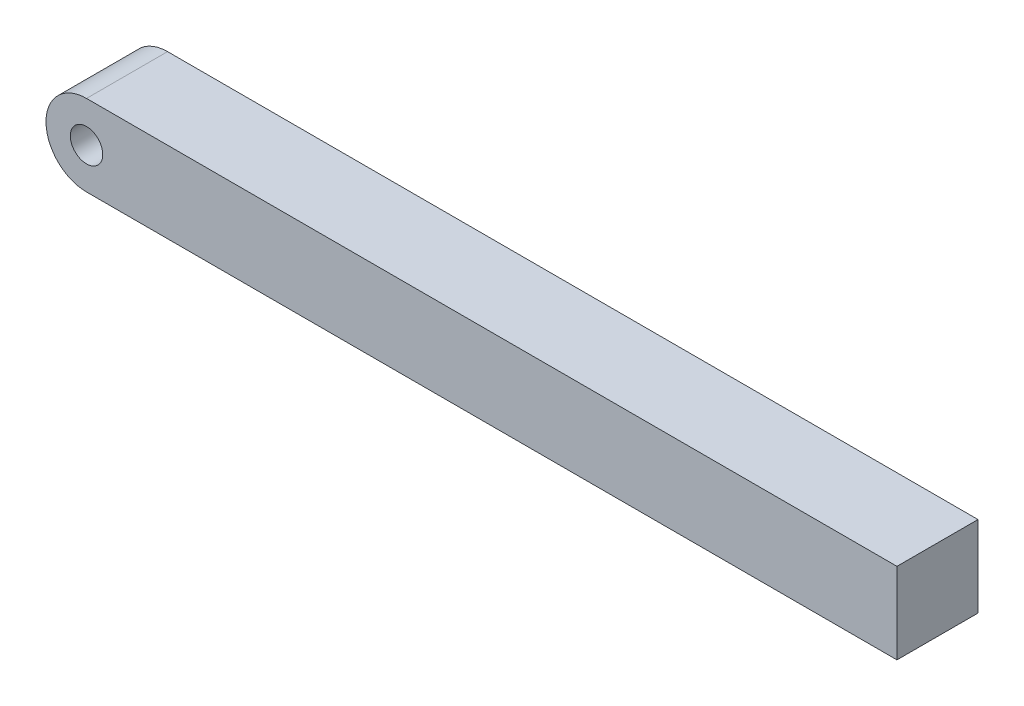
ISO-10303-21;
HEADER;
FILE_DESCRIPTION(('STEP AP214'),'2;1');
FILE_NAME('part.step','',(''),(''),'','','');
FILE_SCHEMA(('AUTOMOTIVE_DESIGN { 1 0 10303 214 1 1 1 1 }'));
ENDSEC;
DATA;
#1=APPLICATION_CONTEXT('core data for automotive mechanical design processes');
#2=APPLICATION_PROTOCOL_DEFINITION('international standard','automotive_design',2000,#1);
#3=PRODUCT_CONTEXT('',#1,'mechanical');
#4=PRODUCT('Part','Part','',(#3));
#5=PRODUCT_RELATED_PRODUCT_CATEGORY('part','',(#4));
#6=PRODUCT_DEFINITION_FORMATION('','',#4);
#7=PRODUCT_DEFINITION_CONTEXT('part definition',#1,'design');
#8=PRODUCT_DEFINITION('design','',#6,#7);
#9=PRODUCT_DEFINITION_SHAPE('','',#8);
#10=(LENGTH_UNIT() NAMED_UNIT(*) SI_UNIT(.MILLI.,.METRE.));
#11=(NAMED_UNIT(*) PLANE_ANGLE_UNIT() SI_UNIT($,.RADIAN.));
#12=(NAMED_UNIT(*) SI_UNIT($,.STERADIAN.) SOLID_ANGLE_UNIT());
#13=UNCERTAINTY_MEASURE_WITH_UNIT(LENGTH_MEASURE(1.E-05),#10,'distance_accuracy_value','');
#14=(GEOMETRIC_REPRESENTATION_CONTEXT(3) GLOBAL_UNCERTAINTY_ASSIGNED_CONTEXT((#13)) GLOBAL_UNIT_ASSIGNED_CONTEXT((#10,
#11,#12)) REPRESENTATION_CONTEXT('',''));
#15=CARTESIAN_POINT('',(0.,0.,0.));
#16=DIRECTION('',(0.,0.,1.));
#17=DIRECTION('',(1.,0.,0.));
#18=AXIS2_PLACEMENT_3D('',#15,#16,#17);
#19=CARTESIAN_POINT('',(-500.,3.7470027081099E-13,100.));
#20=DIRECTION('',(0.,0.,-1.));
#21=DIRECTION('',(-1.,0.,0.));
#22=AXIS2_PLACEMENT_3D('',#19,#20,#21);
#23=CYLINDRICAL_SURFACE('',#22,50.0000000000004);
#24=CARTESIAN_POINT('',(-500.,3.7470027081099E-13,0.));
#25=DIRECTION('',(0.,0.,1.));
#26=DIRECTION('',(1.,0.,0.));
#27=AXIS2_PLACEMENT_3D('',#24,#25,#26);
#28=CIRCLE('',#27,50.0000000000004);
#29=CARTESIAN_POINT('',(-500.,50.0000000000008,0.));
#30=VERTEX_POINT('',#29);
#31=CARTESIAN_POINT('',(-500.,-50.,0.));
#32=VERTEX_POINT('',#31);
#33=EDGE_CURVE('E106',#30,#32,#28,.T.);
#34=ORIENTED_EDGE('',*,*,#33,.T.);
#35=DIRECTION('',(0.,0.,-1.));
#36=VECTOR('',#35,1.);
#37=CARTESIAN_POINT('',(-500.,-50.,100.));
#38=LINE('',#37,#36);
#39=CARTESIAN_POINT('',(-500.,-50.,100.));
#40=VERTEX_POINT('',#39);
#41=EDGE_CURVE('E11',#40,#32,#38,.T.);
#42=ORIENTED_EDGE('',*,*,#41,.F.);
#43=CARTESIAN_POINT('',(-500.,3.7470027081099E-13,100.));
#44=DIRECTION('',(0.,0.,1.));
#45=DIRECTION('',(1.,0.,0.));
#46=AXIS2_PLACEMENT_3D('',#43,#44,#45);
#47=CIRCLE('',#46,50.0000000000004);
#48=CARTESIAN_POINT('',(-500.,50.0000000000008,100.));
#49=VERTEX_POINT('',#48);
#50=EDGE_CURVE('E89',#49,#40,#47,.T.);
#51=ORIENTED_EDGE('',*,*,#50,.F.);
#52=DIRECTION('',(0.,0.,-1.));
#53=VECTOR('',#52,1.);
#54=CARTESIAN_POINT('',(-500.,50.0000000000008,100.));
#55=LINE('',#54,#53);
#56=EDGE_CURVE('E55',#49,#30,#55,.T.);
#57=ORIENTED_EDGE('',*,*,#56,.T.);
#58=EDGE_LOOP('',(#34,#42,#51,#57));
#59=FACE_BOUND('',#58,.T.);
#60=ADVANCED_FACE('F39',(#59),#23,.T.);
#61=CARTESIAN_POINT('',(0.,-50.,100.));
#62=DIRECTION('',(0.,1.,0.));
#63=DIRECTION('',(0.,0.,1.));
#64=AXIS2_PLACEMENT_3D('',#61,#62,#63);
#65=PLANE('',#64);
#66=DIRECTION('',(1.,0.,0.));
#67=VECTOR('',#66,1.);
#68=CARTESIAN_POINT('',(0.,-50.,0.));
#69=LINE('',#68,#67);
#70=CARTESIAN_POINT('',(500.000000000007,-50.,0.));
#71=VERTEX_POINT('',#70);
#72=EDGE_CURVE('E94',#32,#71,#69,.T.);
#73=ORIENTED_EDGE('',*,*,#72,.T.);
#74=DIRECTION('',(0.,0.,-1.));
#75=VECTOR('',#74,1.);
#76=CARTESIAN_POINT('',(500.000000000007,-50.,100.));
#77=LINE('',#76,#75);
#78=CARTESIAN_POINT('',(500.000000000007,-50.,100.));
#79=VERTEX_POINT('',#78);
#80=EDGE_CURVE('E47',#79,#71,#77,.T.);
#81=ORIENTED_EDGE('',*,*,#80,.F.);
#82=DIRECTION('',(1.,0.,0.));
#83=VECTOR('',#82,1.);
#84=CARTESIAN_POINT('',(0.,-50.,100.));
#85=LINE('',#84,#83);
#86=EDGE_CURVE('E81',#40,#79,#85,.T.);
#87=ORIENTED_EDGE('',*,*,#86,.F.);
#88=ORIENTED_EDGE('',*,*,#41,.T.);
#89=EDGE_LOOP('',(#73,#81,#87,#88));
#90=FACE_BOUND('',#89,.T.);
#91=ADVANCED_FACE('F93',(#90),#65,.F.);
#92=CARTESIAN_POINT('',(500.000000000007,0.,100.));
#93=DIRECTION('',(-1.,0.,0.));
#94=DIRECTION('',(0.,0.,1.));
#95=AXIS2_PLACEMENT_3D('',#92,#93,#94);
#96=PLANE('',#95);
#97=DIRECTION('',(0.,1.,0.));
#98=VECTOR('',#97,1.);
#99=CARTESIAN_POINT('',(500.000000000007,0.,0.));
#100=LINE('',#99,#98);
#101=CARTESIAN_POINT('',(500.000000000007,50.0000000000008,0.));
#102=VERTEX_POINT('',#101);
#103=EDGE_CURVE('E109',#71,#102,#100,.T.);
#104=ORIENTED_EDGE('',*,*,#103,.T.);
#105=DIRECTION('',(0.,0.,-1.));
#106=VECTOR('',#105,1.);
#107=CARTESIAN_POINT('',(500.000000000007,50.0000000000008,100.));
#108=LINE('',#107,#106);
#109=CARTESIAN_POINT('',(500.000000000007,50.0000000000008,100.));
#110=VERTEX_POINT('',#109);
#111=EDGE_CURVE('E70',#110,#102,#108,.T.);
#112=ORIENTED_EDGE('',*,*,#111,.F.);
#113=DIRECTION('',(0.,1.,0.));
#114=VECTOR('',#113,1.);
#115=CARTESIAN_POINT('',(500.000000000007,0.,100.));
#116=LINE('',#115,#114);
#117=EDGE_CURVE('E88',#79,#110,#116,.T.);
#118=ORIENTED_EDGE('',*,*,#117,.F.);
#119=ORIENTED_EDGE('',*,*,#80,.T.);
#120=EDGE_LOOP('',(#104,#112,#118,#119));
#121=FACE_BOUND('',#120,.T.);
#122=ADVANCED_FACE('F97',(#121),#96,.F.);
#123=CARTESIAN_POINT('',(0.,50.0000000000008,100.));
#124=DIRECTION('',(0.,1.,0.));
#125=DIRECTION('',(0.,0.,1.));
#126=AXIS2_PLACEMENT_3D('',#123,#124,#125);
#127=PLANE('',#126);
#128=DIRECTION('',(1.,0.,0.));
#129=VECTOR('',#128,1.);
#130=CARTESIAN_POINT('',(0.,50.0000000000008,0.));
#131=LINE('',#130,#129);
#132=EDGE_CURVE('E111',#30,#102,#131,.T.);
#133=ORIENTED_EDGE('',*,*,#132,.F.);
#134=ORIENTED_EDGE('',*,*,#56,.F.);
#135=DIRECTION('',(1.,0.,0.));
#136=VECTOR('',#135,1.);
#137=CARTESIAN_POINT('',(0.,50.0000000000008,100.));
#138=LINE('',#137,#136);
#139=EDGE_CURVE('E98',#49,#110,#138,.T.);
#140=ORIENTED_EDGE('',*,*,#139,.T.);
#141=ORIENTED_EDGE('',*,*,#111,.T.);
#142=EDGE_LOOP('',(#133,#134,#140,#141));
#143=FACE_BOUND('',#142,.T.);
#144=ADVANCED_FACE('F124',(#143),#127,.T.);
#145=CARTESIAN_POINT('',(-500.,3.7470027081099E-13,100.));
#146=DIRECTION('',(0.,0.,-1.));
#147=DIRECTION('',(-1.,0.,0.));
#148=AXIS2_PLACEMENT_3D('',#145,#146,#147);
#149=CYLINDRICAL_SURFACE('',#148,20.);
#150=CARTESIAN_POINT('',(-500.,3.7470027081099E-13,100.));
#151=DIRECTION('',(0.,0.,1.));
#152=DIRECTION('',(1.,0.,0.));
#153=AXIS2_PLACEMENT_3D('',#150,#151,#152);
#154=CIRCLE('',#153,20.);
#155=CARTESIAN_POINT('',(-480.,3.7470027081099E-13,100.));
#156=VERTEX_POINT('',#155);
#157=EDGE_CURVE('E100',#156,#156,#154,.T.);
#158=ORIENTED_EDGE('',*,*,#157,.T.);
#159=EDGE_LOOP('',(#158));
#160=FACE_BOUND('',#159,.T.);
#161=CARTESIAN_POINT('',(-500.,3.7470027081099E-13,0.));
#162=DIRECTION('',(0.,0.,1.));
#163=DIRECTION('',(1.,0.,0.));
#164=AXIS2_PLACEMENT_3D('',#161,#162,#163);
#165=CIRCLE('',#164,20.);
#166=CARTESIAN_POINT('',(-480.,3.7470027081099E-13,0.));
#167=VERTEX_POINT('',#166);
#168=EDGE_CURVE('E114',#167,#167,#165,.T.);
#169=ORIENTED_EDGE('',*,*,#168,.F.);
#170=EDGE_LOOP('',(#169));
#171=FACE_BOUND('',#170,.T.);
#172=ADVANCED_FACE('F122',(#160,#171),#149,.F.);
#173=CARTESIAN_POINT('',(0.,0.,100.));
#174=DIRECTION('',(0.,0.,1.));
#175=DIRECTION('',(1.,0.,0.));
#176=AXIS2_PLACEMENT_3D('',#173,#174,#175);
#177=PLANE('',#176);
#178=ORIENTED_EDGE('',*,*,#50,.T.);
#179=ORIENTED_EDGE('',*,*,#86,.T.);
#180=ORIENTED_EDGE('',*,*,#117,.T.);
#181=ORIENTED_EDGE('',*,*,#139,.F.);
#182=EDGE_LOOP('',(#178,#179,#180,#181));
#183=FACE_BOUND('',#182,.T.);
#184=ORIENTED_EDGE('',*,*,#157,.F.);
#185=EDGE_LOOP('',(#184));
#186=FACE_BOUND('',#185,.T.);
#187=ADVANCED_FACE('F84',(#183,#186),#177,.T.);
#188=CARTESIAN_POINT('',(0.,0.,0.));
#189=DIRECTION('',(0.,0.,1.));
#190=DIRECTION('',(1.,0.,0.));
#191=AXIS2_PLACEMENT_3D('',#188,#189,#190);
#192=PLANE('',#191);
#193=ORIENTED_EDGE('',*,*,#33,.F.);
#194=ORIENTED_EDGE('',*,*,#132,.T.);
#195=ORIENTED_EDGE('',*,*,#103,.F.);
#196=ORIENTED_EDGE('',*,*,#72,.F.);
#197=EDGE_LOOP('',(#193,#194,#195,#196));
#198=FACE_BOUND('',#197,.T.);
#199=ORIENTED_EDGE('',*,*,#168,.T.);
#200=EDGE_LOOP('',(#199));
#201=FACE_BOUND('',#200,.T.);
#202=ADVANCED_FACE('F120',(#198,#201),#192,.F.);
#203=CLOSED_SHELL('',(#60,#91,#122,#144,#172,#187,#202));
#204=MANIFOLD_SOLID_BREP('B2',#203);
#205=ADVANCED_BREP_SHAPE_REPRESENTATION('',(#18,#204),#14);
#206=SHAPE_DEFINITION_REPRESENTATION(#9,#205);
ENDSEC;
END-ISO-10303-21;
